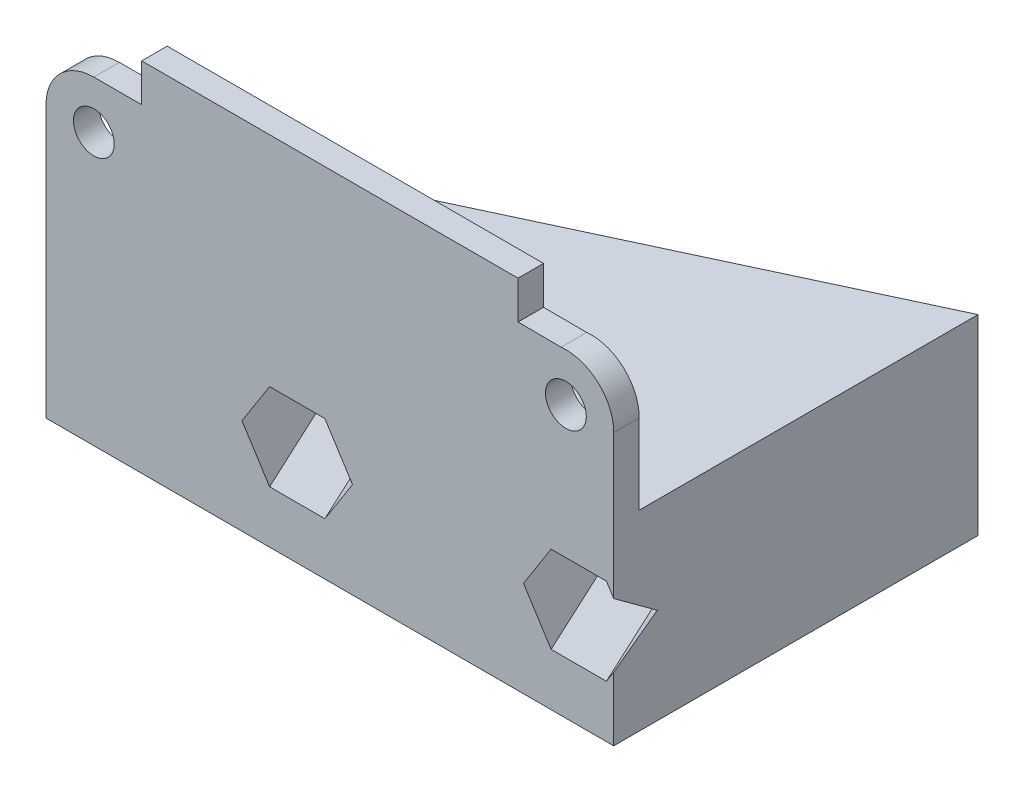
ISO-10303-21;
HEADER;
FILE_DESCRIPTION(('STEP AP214'),'2;1');
FILE_NAME('part.step','',(''),(''),'','','');
FILE_SCHEMA(('AUTOMOTIVE_DESIGN { 1 0 10303 214 1 1 1 1 }'));
ENDSEC;
DATA;
#1=APPLICATION_CONTEXT('core data for automotive mechanical design processes');
#2=APPLICATION_PROTOCOL_DEFINITION('international standard','automotive_design',2000,#1);
#3=PRODUCT_CONTEXT('',#1,'mechanical');
#4=PRODUCT('Part','Part','',(#3));
#5=PRODUCT_RELATED_PRODUCT_CATEGORY('part','',(#4));
#6=PRODUCT_DEFINITION_FORMATION('','',#4);
#7=PRODUCT_DEFINITION_CONTEXT('part definition',#1,'design');
#8=PRODUCT_DEFINITION('design','',#6,#7);
#9=PRODUCT_DEFINITION_SHAPE('','',#8);
#10=(LENGTH_UNIT() NAMED_UNIT(*) SI_UNIT(.MILLI.,.METRE.));
#11=(NAMED_UNIT(*) PLANE_ANGLE_UNIT() SI_UNIT($,.RADIAN.));
#12=(NAMED_UNIT(*) SI_UNIT($,.STERADIAN.) SOLID_ANGLE_UNIT());
#13=UNCERTAINTY_MEASURE_WITH_UNIT(LENGTH_MEASURE(1.E-05),#10,'distance_accuracy_value','');
#14=(GEOMETRIC_REPRESENTATION_CONTEXT(3) GLOBAL_UNCERTAINTY_ASSIGNED_CONTEXT((#13)) GLOBAL_UNIT_ASSIGNED_CONTEXT((#10,
#11,#12)) REPRESENTATION_CONTEXT('',''));
#15=CARTESIAN_POINT('',(0.,0.,0.));
#16=DIRECTION('',(0.,0.,1.));
#17=DIRECTION('',(1.,0.,0.));
#18=AXIS2_PLACEMENT_3D('',#15,#16,#17);
#19=CARTESIAN_POINT('',(7.49999999999989,0.,2.));
#20=DIRECTION('',(1.,0.,0.));
#21=DIRECTION('',(0.,1.,0.));
#22=AXIS2_PLACEMENT_3D('',#19,#20,#21);
#23=PLANE('',#22);
#24=DIRECTION('',(0.,0.590661858214401,-0.806919183841053));
#25=VECTOR('',#24,1.);
#26=CARTESIAN_POINT('',(7.49999999999989,-6.5106045135226,-2.76573842469685));
#27=LINE('',#26,#25);
#28=CARTESIAN_POINT('',(7.49999999999993,-9.99910741451406,2.));
#29=VERTEX_POINT('',#28);
#30=CARTESIAN_POINT('',(7.49999999999989,-7.50000000000001,-1.41409841723495));
#31=VERTEX_POINT('',#30);
#32=EDGE_CURVE('E281',#29,#31,#27,.T.);
#33=ORIENTED_EDGE('',*,*,#32,.F.);
#34=DIRECTION('',(0.,-1.,0.));
#35=VECTOR('',#34,1.);
#36=CARTESIAN_POINT('',(7.49999999999989,0.,2.));
#37=LINE('',#36,#35);
#38=CARTESIAN_POINT('',(7.49999999999989,-15.,2.));
#39=VERTEX_POINT('',#38);
#40=EDGE_CURVE('E319',#29,#39,#37,.T.);
#41=ORIENTED_EDGE('',*,*,#40,.T.);
#42=DIRECTION('',(0.,0.,-1.));
#43=VECTOR('',#42,1.);
#44=CARTESIAN_POINT('',(7.49999999999989,-15.,2.));
#45=LINE('',#44,#43);
#46=CARTESIAN_POINT('',(7.49999999999989,-15.,-26.5526670293718));
#47=VERTEX_POINT('',#46);
#48=EDGE_CURVE('E310',#39,#47,#45,.T.);
#49=ORIENTED_EDGE('',*,*,#48,.T.);
#50=DIRECTION('',(0.,-1.,0.));
#51=VECTOR('',#50,1.);
#52=CARTESIAN_POINT('',(7.49999999999989,0.,-26.5526670293718));
#53=LINE('',#52,#51);
#54=CARTESIAN_POINT('',(7.4999999999999,-6.3770507883697E-13,-26.5526670293718));
#55=VERTEX_POINT('',#54);
#56=EDGE_CURVE('E296',#55,#47,#53,.T.);
#57=ORIENTED_EDGE('',*,*,#56,.F.);
#58=DIRECTION('',(0.,0.,1.));
#59=VECTOR('',#58,1.);
#60=CARTESIAN_POINT('',(7.49999999999989,0.,-65.5647292333401));
#61=LINE('',#60,#59);
#62=CARTESIAN_POINT('',(7.49999999999989,0.,0.));
#63=VERTEX_POINT('',#62);
#64=EDGE_CURVE('E302',#55,#63,#61,.T.);
#65=ORIENTED_EDGE('',*,*,#64,.T.);
#66=DIRECTION('',(0.,-1.,0.));
#67=VECTOR('',#66,1.);
#68=CARTESIAN_POINT('',(7.49999999999989,0.,0.));
#69=LINE('',#68,#67);
#70=CARTESIAN_POINT('',(7.49999999999989,6.27312353150442,0.));
#71=VERTEX_POINT('',#70);
#72=EDGE_CURVE('E314',#71,#63,#69,.T.);
#73=ORIENTED_EDGE('',*,*,#72,.F.);
#74=DIRECTION('',(0.,0.,-1.));
#75=VECTOR('',#74,1.);
#76=CARTESIAN_POINT('',(7.49999999999989,6.27312353150442,2.));
#77=LINE('',#76,#75);
#78=CARTESIAN_POINT('',(7.49999999999989,6.27312353150442,2.));
#79=VERTEX_POINT('',#78);
#80=EDGE_CURVE('E388',#79,#71,#77,.T.);
#81=ORIENTED_EDGE('',*,*,#80,.F.);
#82=CARTESIAN_POINT('',(7.49999999999989,-5.00089258548602,2.));
#83=VERTEX_POINT('',#82);
#84=EDGE_CURVE('E315',#79,#83,#37,.T.);
#85=ORIENTED_EDGE('',*,*,#84,.T.);
#86=DIRECTION('',(0.,0.590661858214399,0.806919183841055));
#87=VECTOR('',#86,1.);
#88=CARTESIAN_POINT('',(7.49999999999989,-3.2561740252381,4.38350734364923));
#89=LINE('',#88,#87);
#90=EDGE_CURVE('E59',#31,#83,#89,.T.);
#91=ORIENTED_EDGE('',*,*,#90,.F.);
#92=EDGE_LOOP('',(#33,#41,#49,#57,#65,#73,#81,#85,#91));
#93=FACE_BOUND('',#92,.T.);
#94=ADVANCED_FACE('F37',(#93),#23,.T.);
#95=CARTESIAN_POINT('',(3.74999999999989,6.27312353150442,2.));
#96=DIRECTION('',(0.,0.,-1.));
#97=DIRECTION('',(-1.,0.,0.));
#98=AXIS2_PLACEMENT_3D('',#95,#96,#97);
#99=CYLINDRICAL_SURFACE('',#98,3.75);
#100=CARTESIAN_POINT('',(3.74999999999989,6.27312353150442,0.));
#101=DIRECTION('',(0.,0.,1.));
#102=DIRECTION('',(1.,0.,0.));
#103=AXIS2_PLACEMENT_3D('',#100,#101,#102);
#104=CIRCLE('',#103,3.75);
#105=CARTESIAN_POINT('',(3.37999999999985,10.0048255560503,0.));
#106=VERTEX_POINT('',#105);
#107=EDGE_CURVE('E345',#71,#106,#104,.T.);
#108=ORIENTED_EDGE('',*,*,#107,.T.);
#109=DIRECTION('',(0.,0.,-1.));
#110=VECTOR('',#109,1.);
#111=CARTESIAN_POINT('',(3.37999999999985,10.0048255560503,2.));
#112=LINE('',#111,#110);
#113=CARTESIAN_POINT('',(3.37999999999985,10.0048255560503,2.));
#114=VERTEX_POINT('',#113);
#115=EDGE_CURVE('E385',#114,#106,#112,.T.);
#116=ORIENTED_EDGE('',*,*,#115,.F.);
#117=CARTESIAN_POINT('',(3.74999999999989,6.27312353150442,2.));
#118=DIRECTION('',(0.,0.,1.));
#119=DIRECTION('',(1.,0.,0.));
#120=AXIS2_PLACEMENT_3D('',#117,#118,#119);
#121=CIRCLE('',#120,3.75);
#122=EDGE_CURVE('E318',#79,#114,#121,.T.);
#123=ORIENTED_EDGE('',*,*,#122,.F.);
#124=ORIENTED_EDGE('',*,*,#80,.T.);
#125=EDGE_LOOP('',(#108,#116,#123,#124));
#126=FACE_BOUND('',#125,.T.);
#127=ADVANCED_FACE('F436',(#126),#99,.T.);
#128=CARTESIAN_POINT('',(0.0542596134633969,10.0228297915413,2.));
#129=DIRECTION('',(-0.00541352287863934,-0.999985346777663,0.));
#130=DIRECTION('',(0.999985346777663,-0.00541352287863934,0.));
#131=AXIS2_PLACEMENT_3D('',#128,#129,#130);
#132=PLANE('',#131);
#133=DIRECTION('',(-0.999985346777663,0.00541352287863934,0.));
#134=VECTOR('',#133,1.);
#135=CARTESIAN_POINT('',(0.0542596134633969,10.0228297915413,0.));
#136=LINE('',#135,#134);
#137=CARTESIAN_POINT('',(-1.06502534655967E-13,10.0231235315044,0.));
#138=VERTEX_POINT('',#137);
#139=EDGE_CURVE('E347',#106,#138,#136,.T.);
#140=ORIENTED_EDGE('',*,*,#139,.T.);
#141=DIRECTION('',(0.,0.,-1.));
#142=VECTOR('',#141,1.);
#143=CARTESIAN_POINT('',(-1.06502534655967E-13,10.0231235315044,2.));
#144=LINE('',#143,#142);
#145=CARTESIAN_POINT('',(-1.06502534655967E-13,10.0231235315044,2.));
#146=VERTEX_POINT('',#145);
#147=EDGE_CURVE('E382',#146,#138,#144,.T.);
#148=ORIENTED_EDGE('',*,*,#147,.F.);
#149=DIRECTION('',(-0.999985346777663,0.00541352287863934,0.));
#150=VECTOR('',#149,1.);
#151=CARTESIAN_POINT('',(0.0542596134633969,10.0228297915413,2.));
#152=LINE('',#151,#150);
#153=EDGE_CURVE('E321',#114,#146,#152,.T.);
#154=ORIENTED_EDGE('',*,*,#153,.F.);
#155=ORIENTED_EDGE('',*,*,#115,.T.);
#156=EDGE_LOOP('',(#140,#148,#154,#155));
#157=FACE_BOUND('',#156,.T.);
#158=ADVANCED_FACE('F441',(#157),#132,.F.);
#159=CARTESIAN_POINT('',(0.,0.,2.));
#160=DIRECTION('',(-1.,0.,0.));
#161=DIRECTION('',(0.,-1.,0.));
#162=AXIS2_PLACEMENT_3D('',#159,#160,#161);
#163=PLANE('',#162);
#164=DIRECTION('',(0.,1.,0.));
#165=VECTOR('',#164,1.);
#166=CARTESIAN_POINT('',(0.,0.,0.));
#167=LINE('',#166,#165);
#168=CARTESIAN_POINT('',(0.,13.0000000000001,0.));
#169=VERTEX_POINT('',#168);
#170=EDGE_CURVE('E349',#138,#169,#167,.T.);
#171=ORIENTED_EDGE('',*,*,#170,.T.);
#172=DIRECTION('',(0.,0.,-1.));
#173=VECTOR('',#172,1.);
#174=CARTESIAN_POINT('',(0.,13.0000000000001,2.));
#175=LINE('',#174,#173);
#176=CARTESIAN_POINT('',(0.,13.0000000000001,2.));
#177=VERTEX_POINT('',#176);
#178=EDGE_CURVE('E379',#177,#169,#175,.T.);
#179=ORIENTED_EDGE('',*,*,#178,.F.);
#180=DIRECTION('',(0.,1.,0.));
#181=VECTOR('',#180,1.);
#182=CARTESIAN_POINT('',(0.,0.,2.));
#183=LINE('',#182,#181);
#184=EDGE_CURVE('E323',#146,#177,#183,.T.);
#185=ORIENTED_EDGE('',*,*,#184,.F.);
#186=ORIENTED_EDGE('',*,*,#147,.T.);
#187=EDGE_LOOP('',(#171,#179,#185,#186));
#188=FACE_BOUND('',#187,.T.);
#189=ADVANCED_FACE('F564',(#188),#163,.F.);
#190=CARTESIAN_POINT('',(0.,13.0000000000001,2.));
#191=DIRECTION('',(0.,-1.,0.));
#192=DIRECTION('',(1.,0.,0.));
#193=AXIS2_PLACEMENT_3D('',#190,#191,#192);
#194=PLANE('',#193);
#195=DIRECTION('',(-1.,0.,0.));
#196=VECTOR('',#195,1.);
#197=CARTESIAN_POINT('',(0.,13.0000000000001,0.));
#198=LINE('',#197,#196);
#199=CARTESIAN_POINT('',(-29.5000000000001,13.0000000000001,0.));
#200=VERTEX_POINT('',#199);
#201=EDGE_CURVE('E351',#169,#200,#198,.T.);
#202=ORIENTED_EDGE('',*,*,#201,.T.);
#203=DIRECTION('',(0.,0.,-1.));
#204=VECTOR('',#203,1.);
#205=CARTESIAN_POINT('',(-29.5000000000001,13.0000000000001,2.));
#206=LINE('',#205,#204);
#207=CARTESIAN_POINT('',(-29.5000000000001,13.0000000000001,2.));
#208=VERTEX_POINT('',#207);
#209=EDGE_CURVE('E376',#208,#200,#206,.T.);
#210=ORIENTED_EDGE('',*,*,#209,.F.);
#211=DIRECTION('',(-1.,0.,0.));
#212=VECTOR('',#211,1.);
#213=CARTESIAN_POINT('',(0.,13.0000000000001,2.));
#214=LINE('',#213,#212);
#215=EDGE_CURVE('E325',#177,#208,#214,.T.);
#216=ORIENTED_EDGE('',*,*,#215,.F.);
#217=ORIENTED_EDGE('',*,*,#178,.T.);
#218=EDGE_LOOP('',(#202,#210,#216,#217));
#219=FACE_BOUND('',#218,.T.);
#220=ADVANCED_FACE('F560',(#219),#194,.F.);
#221=CARTESIAN_POINT('',(-29.5000000000001,0.,2.));
#222=DIRECTION('',(1.,0.,0.));
#223=DIRECTION('',(0.,1.,0.));
#224=AXIS2_PLACEMENT_3D('',#221,#222,#223);
#225=PLANE('',#224);
#226=DIRECTION('',(0.,-1.,0.));
#227=VECTOR('',#226,1.);
#228=CARTESIAN_POINT('',(-29.5000000000001,0.,0.));
#229=LINE('',#228,#227);
#230=CARTESIAN_POINT('',(-29.5000000000001,10.0231235315044,0.));
#231=VERTEX_POINT('',#230);
#232=EDGE_CURVE('E353',#200,#231,#229,.T.);
#233=ORIENTED_EDGE('',*,*,#232,.T.);
#234=DIRECTION('',(0.,0.,-1.));
#235=VECTOR('',#234,1.);
#236=CARTESIAN_POINT('',(-29.5000000000001,10.0231235315044,2.));
#237=LINE('',#236,#235);
#238=CARTESIAN_POINT('',(-29.5000000000001,10.0231235315044,2.));
#239=VERTEX_POINT('',#238);
#240=EDGE_CURVE('E373',#239,#231,#237,.T.);
#241=ORIENTED_EDGE('',*,*,#240,.F.);
#242=DIRECTION('',(0.,-1.,0.));
#243=VECTOR('',#242,1.);
#244=CARTESIAN_POINT('',(-29.5000000000001,0.,2.));
#245=LINE('',#244,#243);
#246=EDGE_CURVE('E327',#208,#239,#245,.T.);
#247=ORIENTED_EDGE('',*,*,#246,.F.);
#248=ORIENTED_EDGE('',*,*,#209,.T.);
#249=EDGE_LOOP('',(#233,#241,#247,#248));
#250=FACE_BOUND('',#249,.T.);
#251=ADVANCED_FACE('F556',(#250),#225,.F.);
#252=CARTESIAN_POINT('',(0.,10.0231235315044,2.));
#253=DIRECTION('',(0.,-1.,0.));
#254=DIRECTION('',(0.,0.,-1.));
#255=AXIS2_PLACEMENT_3D('',#252,#253,#254);
#256=PLANE('',#255);
#257=DIRECTION('',(-1.,0.,0.));
#258=VECTOR('',#257,1.);
#259=CARTESIAN_POINT('',(0.,10.0231235315044,0.));
#260=LINE('',#259,#258);
#261=CARTESIAN_POINT('',(-33.2500000000001,10.0231235315044,0.));
#262=VERTEX_POINT('',#261);
#263=EDGE_CURVE('E355',#231,#262,#260,.T.);
#264=ORIENTED_EDGE('',*,*,#263,.T.);
#265=DIRECTION('',(0.,0.,-1.));
#266=VECTOR('',#265,1.);
#267=CARTESIAN_POINT('',(-33.2500000000001,10.0231235315044,2.));
#268=LINE('',#267,#266);
#269=CARTESIAN_POINT('',(-33.2500000000001,10.0231235315044,2.));
#270=VERTEX_POINT('',#269);
#271=EDGE_CURVE('E370',#270,#262,#268,.T.);
#272=ORIENTED_EDGE('',*,*,#271,.F.);
#273=DIRECTION('',(-1.,0.,0.));
#274=VECTOR('',#273,1.);
#275=CARTESIAN_POINT('',(0.,10.0231235315044,2.));
#276=LINE('',#275,#274);
#277=EDGE_CURVE('E329',#239,#270,#276,.T.);
#278=ORIENTED_EDGE('',*,*,#277,.F.);
#279=ORIENTED_EDGE('',*,*,#240,.T.);
#280=EDGE_LOOP('',(#264,#272,#278,#279));
#281=FACE_BOUND('',#280,.T.);
#282=ADVANCED_FACE('F552',(#281),#256,.F.);
#283=CARTESIAN_POINT('',(-33.2500000000001,6.27312353150443,2.));
#284=DIRECTION('',(0.,0.,-1.));
#285=DIRECTION('',(-1.,0.,0.));
#286=AXIS2_PLACEMENT_3D('',#283,#284,#285);
#287=CYLINDRICAL_SURFACE('',#286,3.75);
#288=CARTESIAN_POINT('',(-33.2500000000001,6.27312353150443,0.));
#289=DIRECTION('',(0.,0.,1.));
#290=DIRECTION('',(1.,0.,0.));
#291=AXIS2_PLACEMENT_3D('',#288,#289,#290);
#292=CIRCLE('',#291,3.75);
#293=CARTESIAN_POINT('',(-37.0000000000001,6.27312353150443,0.));
#294=VERTEX_POINT('',#293);
#295=EDGE_CURVE('E357',#262,#294,#292,.T.);
#296=ORIENTED_EDGE('',*,*,#295,.T.);
#297=DIRECTION('',(0.,0.,-1.));
#298=VECTOR('',#297,1.);
#299=CARTESIAN_POINT('',(-37.0000000000001,6.27312353150443,2.));
#300=LINE('',#299,#298);
#301=CARTESIAN_POINT('',(-37.0000000000001,6.27312353150443,2.));
#302=VERTEX_POINT('',#301);
#303=EDGE_CURVE('E342',#302,#294,#300,.T.);
#304=ORIENTED_EDGE('',*,*,#303,.F.);
#305=CARTESIAN_POINT('',(-33.2500000000001,6.27312353150443,2.));
#306=DIRECTION('',(0.,0.,1.));
#307=DIRECTION('',(1.,0.,0.));
#308=AXIS2_PLACEMENT_3D('',#305,#306,#307);
#309=CIRCLE('',#308,3.75);
#310=EDGE_CURVE('E331',#270,#302,#309,.T.);
#311=ORIENTED_EDGE('',*,*,#310,.F.);
#312=ORIENTED_EDGE('',*,*,#271,.T.);
#313=EDGE_LOOP('',(#296,#304,#311,#312));
#314=FACE_BOUND('',#313,.T.);
#315=ADVANCED_FACE('F548',(#314),#287,.T.);
#316=CARTESIAN_POINT('',(-37.0000000000001,0.,2.));
#317=DIRECTION('',(-1.,0.,0.));
#318=DIRECTION('',(0.,-1.,0.));
#319=AXIS2_PLACEMENT_3D('',#316,#317,#318);
#320=PLANE('',#319);
#321=DIRECTION('',(0.,1.,0.));
#322=VECTOR('',#321,1.);
#323=CARTESIAN_POINT('',(-37.0000000000001,0.,0.));
#324=LINE('',#323,#322);
#325=CARTESIAN_POINT('',(-37.0000000000001,0.,0.));
#326=VERTEX_POINT('',#325);
#327=EDGE_CURVE('E360',#326,#294,#324,.T.);
#328=ORIENTED_EDGE('',*,*,#327,.F.);
#329=DIRECTION('',(0.,0.,1.));
#330=VECTOR('',#329,1.);
#331=CARTESIAN_POINT('',(-37.0000000000001,0.,-65.5647292333401));
#332=LINE('',#331,#330);
#333=CARTESIAN_POINT('',(-37.0000000000001,0.,-5.80197624147447));
#334=VERTEX_POINT('',#333);
#335=EDGE_CURVE('E303',#334,#326,#332,.T.);
#336=ORIENTED_EDGE('',*,*,#335,.F.);
#337=DIRECTION('',(0.,1.,0.));
#338=VECTOR('',#337,1.);
#339=CARTESIAN_POINT('',(-37.0000000000001,0.,-5.80197624147447));
#340=LINE('',#339,#338);
#341=CARTESIAN_POINT('',(-37.0000000000001,-15.,-5.80197624147449));
#342=VERTEX_POINT('',#341);
#343=EDGE_CURVE('E290',#342,#334,#340,.T.);
#344=ORIENTED_EDGE('',*,*,#343,.F.);
#345=DIRECTION('',(0.,0.,-1.));
#346=VECTOR('',#345,1.);
#347=CARTESIAN_POINT('',(-37.0000000000001,-15.,2.));
#348=LINE('',#347,#346);
#349=CARTESIAN_POINT('',(-37.0000000000001,-15.,2.));
#350=VERTEX_POINT('',#349);
#351=EDGE_CURVE('E312',#350,#342,#348,.T.);
#352=ORIENTED_EDGE('',*,*,#351,.F.);
#353=DIRECTION('',(0.,1.,0.));
#354=VECTOR('',#353,1.);
#355=CARTESIAN_POINT('',(-37.0000000000001,0.,2.));
#356=LINE('',#355,#354);
#357=EDGE_CURVE('E333',#350,#302,#356,.T.);
#358=ORIENTED_EDGE('',*,*,#357,.T.);
#359=ORIENTED_EDGE('',*,*,#303,.T.);
#360=EDGE_LOOP('',(#328,#336,#344,#352,#358,#359));
#361=FACE_BOUND('',#360,.T.);
#362=ADVANCED_FACE('F544',(#361),#320,.T.);
#363=CARTESIAN_POINT('',(-33.2500000000001,6.27312353150443,2.));
#364=DIRECTION('',(0.,0.,-1.));
#365=DIRECTION('',(-1.,0.,0.));
#366=AXIS2_PLACEMENT_3D('',#363,#364,#365);
#367=CYLINDRICAL_SURFACE('',#366,1.6);
#368=CARTESIAN_POINT('',(-33.2500000000001,6.27312353150443,2.));
#369=DIRECTION('',(0.,0.,1.));
#370=DIRECTION('',(1.,0.,0.));
#371=AXIS2_PLACEMENT_3D('',#368,#369,#370);
#372=CIRCLE('',#371,1.6);
#373=CARTESIAN_POINT('',(-31.6500000000001,6.27312353150443,2.));
#374=VERTEX_POINT('',#373);
#375=EDGE_CURVE('E336',#374,#374,#372,.T.);
#376=ORIENTED_EDGE('',*,*,#375,.T.);
#377=EDGE_LOOP('',(#376));
#378=FACE_BOUND('',#377,.T.);
#379=CARTESIAN_POINT('',(-33.2500000000001,6.27312353150443,0.));
#380=DIRECTION('',(0.,0.,1.));
#381=DIRECTION('',(1.,0.,0.));
#382=AXIS2_PLACEMENT_3D('',#379,#380,#381);
#383=CIRCLE('',#382,1.6);
#384=CARTESIAN_POINT('',(-31.6500000000001,6.27312353150443,0.));
#385=VERTEX_POINT('',#384);
#386=EDGE_CURVE('E362',#385,#385,#383,.T.);
#387=ORIENTED_EDGE('',*,*,#386,.F.);
#388=EDGE_LOOP('',(#387));
#389=FACE_BOUND('',#388,.T.);
#390=ADVANCED_FACE('F540',(#378,#389),#367,.F.);
#391=CARTESIAN_POINT('',(3.74999999999989,6.27312353150442,2.));
#392=DIRECTION('',(0.,0.,-1.));
#393=DIRECTION('',(-1.,0.,0.));
#394=AXIS2_PLACEMENT_3D('',#391,#392,#393);
#395=CYLINDRICAL_SURFACE('',#394,1.6);
#396=CARTESIAN_POINT('',(3.74999999999989,6.27312353150442,2.));
#397=DIRECTION('',(0.,0.,1.));
#398=DIRECTION('',(1.,0.,0.));
#399=AXIS2_PLACEMENT_3D('',#396,#397,#398);
#400=CIRCLE('',#399,1.6);
#401=CARTESIAN_POINT('',(5.34999999999989,6.27312353150442,2.));
#402=VERTEX_POINT('',#401);
#403=EDGE_CURVE('E339',#402,#402,#400,.T.);
#404=ORIENTED_EDGE('',*,*,#403,.T.);
#405=EDGE_LOOP('',(#404));
#406=FACE_BOUND('',#405,.T.);
#407=CARTESIAN_POINT('',(3.74999999999989,6.27312353150442,0.));
#408=DIRECTION('',(0.,0.,1.));
#409=DIRECTION('',(1.,0.,0.));
#410=AXIS2_PLACEMENT_3D('',#407,#408,#409);
#411=CIRCLE('',#410,1.6);
#412=CARTESIAN_POINT('',(5.34999999999989,6.27312353150442,0.));
#413=VERTEX_POINT('',#412);
#414=EDGE_CURVE('E365',#413,#413,#411,.T.);
#415=ORIENTED_EDGE('',*,*,#414,.F.);
#416=EDGE_LOOP('',(#415));
#417=FACE_BOUND('',#416,.T.);
#418=ADVANCED_FACE('F535',(#406,#417),#395,.F.);
#419=CARTESIAN_POINT('',(0.,0.,2.));
#420=DIRECTION('',(0.,0.,1.));
#421=DIRECTION('',(1.,0.,0.));
#422=AXIS2_PLACEMENT_3D('',#419,#420,#421);
#423=PLANE('',#422);
#424=DIRECTION('',(-0.537278777543522,0.843404716136529,0.));
#425=VECTOR('',#424,1.);
#426=CARTESIAN_POINT('',(-12.628485118268,-8.04479381814514,2.));
#427=LINE('',#426,#425);
#428=CARTESIAN_POINT('',(-12.9755381415984,-7.50000000000002,2.));
#429=VERTEX_POINT('',#428);
#430=CARTESIAN_POINT('',(-15.1414589726034,-4.10000000000001,2.));
#431=VERTEX_POINT('',#430);
#432=EDGE_CURVE('E11',#429,#431,#427,.T.);
#433=ORIENTED_EDGE('',*,*,#432,.F.);
#434=DIRECTION('',(0.53727877754352,0.84340471613653,0.));
#435=VECTOR('',#434,1.);
#436=CARTESIAN_POINT('',(-5.83133329536394,3.71476654616522,2.));
#437=LINE('',#436,#435);
#438=CARTESIAN_POINT('',(-15.1414589726034,-10.9,2.));
#439=VERTEX_POINT('',#438);
#440=EDGE_CURVE('E206',#439,#429,#437,.T.);
#441=ORIENTED_EDGE('',*,*,#440,.F.);
#442=DIRECTION('',(1.,0.,0.));
#443=VECTOR('',#442,1.);
#444=CARTESIAN_POINT('',(0.,-10.9,2.));
#445=LINE('',#444,#443);
#446=CARTESIAN_POINT('',(-19.4733006346134,-10.9,2.));
#447=VERTEX_POINT('',#446);
#448=EDGE_CURVE('E403',#447,#439,#445,.T.);
#449=ORIENTED_EDGE('',*,*,#448,.F.);
#450=DIRECTION('',(0.53727877754352,-0.84340471613653,0.));
#451=VECTOR('',#450,1.);
#452=CARTESIAN_POINT('',(-18.7912361043678,-11.9706852114069,2.));
#453=LINE('',#452,#451);
#454=CARTESIAN_POINT('',(-21.6392214656184,-7.50000000000002,2.));
#455=VERTEX_POINT('',#454);
#456=EDGE_CURVE('E405',#455,#447,#453,.T.);
#457=ORIENTED_EDGE('',*,*,#456,.F.);
#458=DIRECTION('',(-0.537278777543519,-0.84340471613653,0.));
#459=VECTOR('',#458,1.);
#460=CARTESIAN_POINT('',(-11.9940842814637,7.64065793942699,2.));
#461=LINE('',#460,#459);
#462=CARTESIAN_POINT('',(-19.4733006346134,-4.10000000000001,2.));
#463=VERTEX_POINT('',#462);
#464=EDGE_CURVE('E407',#463,#455,#461,.T.);
#465=ORIENTED_EDGE('',*,*,#464,.F.);
#466=DIRECTION('',(-1.,0.,0.));
#467=VECTOR('',#466,1.);
#468=CARTESIAN_POINT('',(0.,-4.10000000000001,2.));
#469=LINE('',#468,#467);
#470=EDGE_CURVE('E44',#431,#463,#469,.T.);
#471=ORIENTED_EDGE('',*,*,#470,.F.);
#472=EDGE_LOOP('',(#433,#441,#449,#457,#465,#471));
#473=FACE_BOUND('',#472,.T.);
#474=DIRECTION('',(0.53727877754352,0.84340471613653,0.));
#475=VECTOR('',#474,1.);
#476=CARTESIAN_POINT('',(9.86601644334189,-6.28500309813884,2.));
#477=LINE('',#476,#475);
#478=CARTESIAN_POINT('',(6.9260994066464,-10.9,2.));
#479=VERTEX_POINT('',#478);
#480=EDGE_CURVE('E400',#479,#29,#477,.T.);
#481=ORIENTED_EDGE('',*,*,#480,.F.);
#482=DIRECTION('',(1.,0.,0.));
#483=VECTOR('',#482,1.);
#484=CARTESIAN_POINT('',(0.,-10.9,2.));
#485=LINE('',#484,#483);
#486=CARTESIAN_POINT('',(2.59425774463639,-10.9,2.));
#487=VERTEX_POINT('',#486);
#488=EDGE_CURVE('E398',#487,#479,#485,.T.);
#489=ORIENTED_EDGE('',*,*,#488,.F.);
#490=DIRECTION('',(0.537278777543521,-0.84340471613653,0.));
#491=VECTOR('',#490,1.);
#492=CARTESIAN_POINT('',(-3.09388636566199,-1.97091556710284,2.));
#493=LINE('',#492,#491);
#494=CARTESIAN_POINT('',(0.428336913631382,-7.50000000000002,2.));
#495=VERTEX_POINT('',#494);
#496=EDGE_CURVE('E396',#495,#487,#493,.T.);
#497=ORIENTED_EDGE('',*,*,#496,.F.);
#498=DIRECTION('',(-0.537278777543521,-0.843404716136529,0.));
#499=VECTOR('',#498,1.);
#500=CARTESIAN_POINT('',(3.70326545724214,-2.35911170487707,2.));
#501=LINE('',#500,#499);
#502=CARTESIAN_POINT('',(2.59425774463639,-4.10000000000001,2.));
#503=VERTEX_POINT('',#502);
#504=EDGE_CURVE('E394',#503,#495,#501,.T.);
#505=ORIENTED_EDGE('',*,*,#504,.F.);
#506=DIRECTION('',(-1.,0.,0.));
#507=VECTOR('',#506,1.);
#508=CARTESIAN_POINT('',(0.,-4.10000000000002,2.));
#509=LINE('',#508,#507);
#510=CARTESIAN_POINT('',(6.92609940664639,-4.10000000000001,2.));
#511=VERTEX_POINT('',#510);
#512=EDGE_CURVE('E392',#511,#503,#509,.T.);
#513=ORIENTED_EDGE('',*,*,#512,.F.);
#514=DIRECTION('',(-0.537278777543521,0.843404716136529,0.));
#515=VECTOR('',#514,1.);
#516=CARTESIAN_POINT('',(3.06886462043774,1.95497582615893,2.));
#517=LINE('',#516,#515);
#518=EDGE_CURVE('E390',#83,#511,#517,.T.);
#519=ORIENTED_EDGE('',*,*,#518,.F.);
#520=ORIENTED_EDGE('',*,*,#84,.F.);
#521=ORIENTED_EDGE('',*,*,#122,.T.);
#522=ORIENTED_EDGE('',*,*,#153,.T.);
#523=ORIENTED_EDGE('',*,*,#184,.T.);
#524=ORIENTED_EDGE('',*,*,#215,.T.);
#525=ORIENTED_EDGE('',*,*,#246,.T.);
#526=ORIENTED_EDGE('',*,*,#277,.T.);
#527=ORIENTED_EDGE('',*,*,#310,.T.);
#528=ORIENTED_EDGE('',*,*,#357,.F.);
#529=DIRECTION('',(-1.,0.,0.));
#530=VECTOR('',#529,1.);
#531=CARTESIAN_POINT('',(0.,-15.,2.));
#532=LINE('',#531,#530);
#533=EDGE_CURVE('E299',#39,#350,#532,.T.);
#534=ORIENTED_EDGE('',*,*,#533,.F.);
#535=ORIENTED_EDGE('',*,*,#40,.F.);
#536=EDGE_LOOP('',(#481,#489,#497,#505,#513,#519,#520,#521,#522,#523,#524,#525,#526,#527,#528,
#534,#535));
#537=FACE_BOUND('',#536,.T.);
#538=ORIENTED_EDGE('',*,*,#375,.F.);
#539=EDGE_LOOP('',(#538));
#540=FACE_BOUND('',#539,.T.);
#541=ORIENTED_EDGE('',*,*,#403,.F.);
#542=EDGE_LOOP('',(#541));
#543=FACE_BOUND('',#542,.T.);
#544=ADVANCED_FACE('F419',(#473,#537,#540,#543),#423,.T.);
#545=CARTESIAN_POINT('',(0.,0.,0.));
#546=DIRECTION('',(0.,0.,1.));
#547=DIRECTION('',(1.,0.,0.));
#548=AXIS2_PLACEMENT_3D('',#545,#546,#547);
#549=PLANE('',#548);
#550=ORIENTED_EDGE('',*,*,#72,.T.);
#551=DIRECTION('',(-1.,0.,0.));
#552=VECTOR('',#551,1.);
#553=CARTESIAN_POINT('',(0.,0.,0.));
#554=LINE('',#553,#552);
#555=EDGE_CURVE('E287',#63,#326,#554,.T.);
#556=ORIENTED_EDGE('',*,*,#555,.T.);
#557=ORIENTED_EDGE('',*,*,#327,.T.);
#558=ORIENTED_EDGE('',*,*,#295,.F.);
#559=ORIENTED_EDGE('',*,*,#263,.F.);
#560=ORIENTED_EDGE('',*,*,#232,.F.);
#561=ORIENTED_EDGE('',*,*,#201,.F.);
#562=ORIENTED_EDGE('',*,*,#170,.F.);
#563=ORIENTED_EDGE('',*,*,#139,.F.);
#564=ORIENTED_EDGE('',*,*,#107,.F.);
#565=EDGE_LOOP('',(#550,#556,#557,#558,#559,#560,#561,#562,#563,#564));
#566=FACE_BOUND('',#565,.T.);
#567=ORIENTED_EDGE('',*,*,#386,.T.);
#568=EDGE_LOOP('',(#567));
#569=FACE_BOUND('',#568,.T.);
#570=ORIENTED_EDGE('',*,*,#414,.T.);
#571=EDGE_LOOP('',(#570));
#572=FACE_BOUND('',#571,.T.);
#573=ADVANCED_FACE('F468',(#566,#569,#572),#549,.F.);
#574=CARTESIAN_POINT('',(0.,-15.,2.));
#575=DIRECTION('',(0.,-1.,0.));
#576=DIRECTION('',(1.,0.,0.));
#577=AXIS2_PLACEMENT_3D('',#574,#575,#576);
#578=PLANE('',#577);
#579=ORIENTED_EDGE('',*,*,#351,.T.);
#580=DIRECTION('',(-0.906307787036651,0.,0.422618261740698));
#581=VECTOR('',#580,1.);
#582=CARTESIAN_POINT('',(16.2820331966563,-15.,-30.6477963631441));
#583=LINE('',#582,#581);
#584=EDGE_CURVE('E292',#47,#342,#583,.T.);
#585=ORIENTED_EDGE('',*,*,#584,.F.);
#586=ORIENTED_EDGE('',*,*,#48,.F.);
#587=ORIENTED_EDGE('',*,*,#533,.T.);
#588=EDGE_LOOP('',(#579,#585,#586,#587));
#589=FACE_BOUND('',#588,.T.);
#590=ADVANCED_FACE('F453',(#589),#578,.T.);
#591=CARTESIAN_POINT('',(0.,0.,-65.5647292333401));
#592=DIRECTION('',(0.,1.,0.));
#593=DIRECTION('',(-1.,0.,0.));
#594=AXIS2_PLACEMENT_3D('',#591,#592,#593);
#595=PLANE('',#594);
#596=ORIENTED_EDGE('',*,*,#64,.F.);
#597=DIRECTION('',(-0.906307787036651,0.,0.422618261740698));
#598=VECTOR('',#597,1.);
#599=CARTESIAN_POINT('',(16.2820331966563,0.,-30.6477963631441));
#600=LINE('',#599,#598);
#601=EDGE_CURVE('E293',#55,#334,#600,.T.);
#602=ORIENTED_EDGE('',*,*,#601,.T.);
#603=ORIENTED_EDGE('',*,*,#335,.T.);
#604=ORIENTED_EDGE('',*,*,#555,.F.);
#605=EDGE_LOOP('',(#596,#602,#603,#604));
#606=FACE_BOUND('',#605,.T.);
#607=ADVANCED_FACE('F462',(#606),#595,.T.);
#608=CARTESIAN_POINT('',(-41.3077273826378,-64.7999999999976,-3.79324997370661));
#609=DIRECTION('',(-0.422618261740698,0.,-0.906307787036651));
#610=DIRECTION('',(-0.906307787036651,0.,0.422618261740698));
#611=AXIS2_PLACEMENT_3D('',#608,#609,#610);
#612=PLANE('',#611);
#613=CARTESIAN_POINT('',(-23.8129340421164,-7.5,-11.9512060862307));
#614=DIRECTION('',(-0.422618261740698,0.,-0.906307787036651));
#615=DIRECTION('',(-0.906307787036651,0.,0.422618261740698));
#616=AXIS2_PLACEMENT_3D('',#613,#614,#615);
#617=CIRCLE('',#616,2.);
#618=CARTESIAN_POINT('',(-25.6255496161897,-7.5,-11.1059695627493));
#619=VERTEX_POINT('',#618);
#620=EDGE_CURVE('E284',#619,#619,#617,.T.);
#621=ORIENTED_EDGE('',*,*,#620,.F.);
#622=EDGE_LOOP('',(#621));
#623=FACE_BOUND('',#622,.T.);
#624=CARTESIAN_POINT('',(-5.68677830138339,-7.49999999999999,-20.4035713210447));
#625=DIRECTION('',(-0.422618261740698,0.,-0.906307787036651));
#626=DIRECTION('',(-0.906307787036651,0.,0.422618261740698));
#627=AXIS2_PLACEMENT_3D('',#624,#625,#626);
#628=CIRCLE('',#627,2.);
#629=CARTESIAN_POINT('',(-7.49939387545669,-7.49999999999999,-19.5583347975633));
#630=VERTEX_POINT('',#629);
#631=EDGE_CURVE('E283',#630,#630,#628,.T.);
#632=ORIENTED_EDGE('',*,*,#631,.F.);
#633=EDGE_LOOP('',(#632));
#634=FACE_BOUND('',#633,.T.);
#635=ORIENTED_EDGE('',*,*,#56,.T.);
#636=ORIENTED_EDGE('',*,*,#584,.T.);
#637=ORIENTED_EDGE('',*,*,#343,.T.);
#638=ORIENTED_EDGE('',*,*,#601,.F.);
#639=EDGE_LOOP('',(#635,#636,#637,#638));
#640=FACE_BOUND('',#639,.T.);
#641=ADVANCED_FACE('F458',(#623,#634,#640),#612,.T.);
#642=CARTESIAN_POINT('',(5.24952765565496,-7.50000000000002,3.04941248863409));
#643=DIRECTION('',(-0.422618261740698,0.,-0.906307787036651));
#644=DIRECTION('',(-0.906307787036651,0.,0.422618261740698));
#645=AXIS2_PLACEMENT_3D('',#642,#643,#644);
#646=CYLINDRICAL_SURFACE('',#645,2.);
#647=CARTESIAN_POINT('',(-3.99630525442059,-7.49999999999999,-16.7783401728981));
#648=DIRECTION('',(-0.422618261740698,0.,-0.906307787036651));
#649=DIRECTION('',(-0.906307787036651,0.,0.422618261740698));
#650=AXIS2_PLACEMENT_3D('',#647,#648,#649);
#651=CIRCLE('',#650,2.);
#652=CARTESIAN_POINT('',(-5.8089208284939,-7.49999999999999,-15.9331036494167));
#653=VERTEX_POINT('',#652);
#654=EDGE_CURVE('E248',#653,#653,#651,.T.);
#655=ORIENTED_EDGE('',*,*,#654,.F.);
#656=EDGE_LOOP('',(#655));
#657=FACE_BOUND('',#656,.T.);
#658=ORIENTED_EDGE('',*,*,#631,.T.);
#659=EDGE_LOOP('',(#658));
#660=FACE_BOUND('',#659,.T.);
#661=ADVANCED_FACE('F521',(#657,#660),#646,.F.);
#662=CARTESIAN_POINT('',(-12.8766280850781,-7.50000000000003,11.501777723448));
#663=DIRECTION('',(-0.422618261740698,0.,-0.906307787036651));
#664=DIRECTION('',(-0.906307787036651,0.,0.422618261740698));
#665=AXIS2_PLACEMENT_3D('',#662,#663,#664);
#666=CYLINDRICAL_SURFACE('',#665,2.);
#667=CARTESIAN_POINT('',(-22.1224609951536,-7.5,-8.32597493808411));
#668=DIRECTION('',(-0.422618261740698,0.,-0.906307787036651));
#669=DIRECTION('',(-0.906307787036651,0.,0.422618261740698));
#670=AXIS2_PLACEMENT_3D('',#667,#668,#669);
#671=CIRCLE('',#670,2.);
#672=CARTESIAN_POINT('',(-23.9350765692269,-7.5,-7.48073841460272));
#673=VERTEX_POINT('',#672);
#674=EDGE_CURVE('E226',#673,#673,#671,.T.);
#675=ORIENTED_EDGE('',*,*,#674,.F.);
#676=EDGE_LOOP('',(#675));
#677=FACE_BOUND('',#676,.T.);
#678=ORIENTED_EDGE('',*,*,#620,.T.);
#679=EDGE_LOOP('',(#678));
#680=FACE_BOUND('',#679,.T.);
#681=ADVANCED_FACE('F518',(#677,#680),#666,.F.);
#682=CARTESIAN_POINT('',(-11.0975541327096,-4.10000000000003,10.6721819150345));
#683=DIRECTION('',(0.784885567221396,0.500000000000001,-0.365998150770664));
#684=DIRECTION('',(-0.537278777543522,0.843404716136529,0.));
#685=AXIS2_PLACEMENT_3D('',#682,#683,#684);
#686=PLANE('',#685);
#687=ORIENTED_EDGE('',*,*,#432,.T.);
#688=DIRECTION('',(-0.422618261740698,0.,-0.906307787036651));
#689=VECTOR('',#688,1.);
#690=CARTESIAN_POINT('',(-11.0975541327096,-4.10000000000003,10.6721819150345));
#691=LINE('',#690,#689);
#692=CARTESIAN_POINT('',(-20.3433870427851,-4.1,-9.15557074649761));
#693=VERTEX_POINT('',#692);
#694=EDGE_CURVE('E225',#431,#693,#691,.T.);
#695=ORIENTED_EDGE('',*,*,#694,.T.);
#696=DIRECTION('',(0.453153893518326,-0.866025403784438,-0.211309130870351));
#697=VECTOR('',#696,1.);
#698=CARTESIAN_POINT('',(-20.3433870427851,-4.1,-9.15557074649761));
#699=LINE('',#698,#697);
#700=CARTESIAN_POINT('',(-18.5643130904166,-7.5,-9.98516655491113));
#701=VERTEX_POINT('',#700);
#702=EDGE_CURVE('E217',#693,#701,#699,.T.);
#703=ORIENTED_EDGE('',*,*,#702,.T.);
#704=DIRECTION('',(-0.422618261740698,0.,-0.906307787036651));
#705=VECTOR('',#704,1.);
#706=CARTESIAN_POINT('',(-9.31848018034106,-7.50000000000003,9.84258610662102));
#707=LINE('',#706,#705);
#708=EDGE_CURVE('E201',#429,#701,#707,.T.);
#709=ORIENTED_EDGE('',*,*,#708,.F.);
#710=EDGE_LOOP('',(#687,#695,#703,#709));
#711=FACE_BOUND('',#710,.T.);
#712=ADVANCED_FACE('F223',(#711),#686,.F.);
#713=CARTESIAN_POINT('',(-14.6557020374466,-4.10000000000003,12.3313735318616));
#714=DIRECTION('',(0.,1.,0.));
#715=DIRECTION('',(0.,0.,1.));
#716=AXIS2_PLACEMENT_3D('',#713,#714,#715);
#717=PLANE('',#716);
#718=ORIENTED_EDGE('',*,*,#470,.T.);
#719=DIRECTION('',(-0.422618261740698,0.,-0.906307787036651));
#720=VECTOR('',#719,1.);
#721=CARTESIAN_POINT('',(-14.6557020374466,-4.10000000000003,12.3313735318616));
#722=LINE('',#721,#720);
#723=CARTESIAN_POINT('',(-23.9015349475221,-4.1,-7.4963791296706));
#724=VERTEX_POINT('',#723);
#725=EDGE_CURVE('E241',#463,#724,#722,.T.);
#726=ORIENTED_EDGE('',*,*,#725,.T.);
#727=DIRECTION('',(0.906307787036651,0.,-0.422618261740698));
#728=VECTOR('',#727,1.);
#729=CARTESIAN_POINT('',(-23.9015349475221,-4.1,-7.4963791296706));
#730=LINE('',#729,#728);
#731=EDGE_CURVE('E210',#724,#693,#730,.T.);
#732=ORIENTED_EDGE('',*,*,#731,.T.);
#733=ORIENTED_EDGE('',*,*,#694,.F.);
#734=EDGE_LOOP('',(#718,#726,#732,#733));
#735=FACE_BOUND('',#734,.T.);
#736=ADVANCED_FACE('F411',(#735),#717,.F.);
#737=CARTESIAN_POINT('',(-16.4347759898151,-7.50000000000003,13.1609693402751));
#738=DIRECTION('',(-0.784885567221397,0.499999999999998,0.365998150770666));
#739=DIRECTION('',(-0.537278777543519,-0.84340471613653,0.));
#740=AXIS2_PLACEMENT_3D('',#737,#738,#739);
#741=PLANE('',#740);
#742=ORIENTED_EDGE('',*,*,#464,.T.);
#743=DIRECTION('',(-0.422618261740698,0.,-0.906307787036651));
#744=VECTOR('',#743,1.);
#745=CARTESIAN_POINT('',(-16.4347759898151,-7.50000000000003,13.1609693402751));
#746=LINE('',#745,#744);
#747=CARTESIAN_POINT('',(-25.6806088998906,-7.50000000000001,-6.6667833212571));
#748=VERTEX_POINT('',#747);
#749=EDGE_CURVE('E243',#455,#748,#746,.T.);
#750=ORIENTED_EDGE('',*,*,#749,.T.);
#751=DIRECTION('',(0.453153893518324,0.86602540378444,-0.211309130870347));
#752=VECTOR('',#751,1.);
#753=CARTESIAN_POINT('',(-25.6806088998906,-7.50000000000001,-6.6667833212571));
#754=LINE('',#753,#752);
#755=EDGE_CURVE('E236',#748,#724,#754,.T.);
#756=ORIENTED_EDGE('',*,*,#755,.T.);
#757=ORIENTED_EDGE('',*,*,#725,.F.);
#758=EDGE_LOOP('',(#742,#750,#756,#757));
#759=FACE_BOUND('',#758,.T.);
#760=ADVANCED_FACE('F415',(#759),#741,.F.);
#761=CARTESIAN_POINT('',(-14.6557020374466,-10.9,12.3313735318615));
#762=DIRECTION('',(-0.784885567221397,-0.5,0.365998150770665));
#763=DIRECTION('',(0.53727877754352,-0.84340471613653,0.));
#764=AXIS2_PLACEMENT_3D('',#761,#762,#763);
#765=PLANE('',#764);
#766=ORIENTED_EDGE('',*,*,#456,.T.);
#767=DIRECTION('',(-0.422618261740698,0.,-0.906307787036651));
#768=VECTOR('',#767,1.);
#769=CARTESIAN_POINT('',(-14.6557020374466,-10.9,12.3313735318615));
#770=LINE('',#769,#768);
#771=CARTESIAN_POINT('',(-23.9015349475221,-10.9,-7.49637912967061));
#772=VERTEX_POINT('',#771);
#773=EDGE_CURVE('E245',#447,#772,#770,.T.);
#774=ORIENTED_EDGE('',*,*,#773,.T.);
#775=DIRECTION('',(-0.453153893518325,0.866025403784439,0.211309130870349));
#776=VECTOR('',#775,1.);
#777=CARTESIAN_POINT('',(-23.9015349475221,-10.9,-7.49637912967061));
#778=LINE('',#777,#776);
#779=EDGE_CURVE('E233',#772,#748,#778,.T.);
#780=ORIENTED_EDGE('',*,*,#779,.T.);
#781=ORIENTED_EDGE('',*,*,#749,.F.);
#782=EDGE_LOOP('',(#766,#774,#780,#781));
#783=FACE_BOUND('',#782,.T.);
#784=ADVANCED_FACE('F424',(#783),#765,.F.);
#785=CARTESIAN_POINT('',(-11.0975541327096,-10.9,10.6721819150345));
#786=DIRECTION('',(0.,-1.,0.));
#787=DIRECTION('',(0.,0.,-1.));
#788=AXIS2_PLACEMENT_3D('',#785,#786,#787);
#789=PLANE('',#788);
#790=ORIENTED_EDGE('',*,*,#448,.T.);
#791=DIRECTION('',(-0.422618261740698,0.,-0.906307787036651));
#792=VECTOR('',#791,1.);
#793=CARTESIAN_POINT('',(-11.0975541327096,-10.9,10.6721819150345));
#794=LINE('',#793,#792);
#795=CARTESIAN_POINT('',(-20.3433870427851,-10.9,-9.15557074649763));
#796=VERTEX_POINT('',#795);
#797=EDGE_CURVE('E51',#439,#796,#794,.T.);
#798=ORIENTED_EDGE('',*,*,#797,.T.);
#799=DIRECTION('',(-0.906307787036651,0.,0.422618261740698));
#800=VECTOR('',#799,1.);
#801=CARTESIAN_POINT('',(-20.3433870427851,-10.9,-9.15557074649763));
#802=LINE('',#801,#800);
#803=EDGE_CURVE('E221',#796,#772,#802,.T.);
#804=ORIENTED_EDGE('',*,*,#803,.T.);
#805=ORIENTED_EDGE('',*,*,#773,.F.);
#806=EDGE_LOOP('',(#790,#798,#804,#805));
#807=FACE_BOUND('',#806,.T.);
#808=ADVANCED_FACE('F426',(#807),#789,.F.);
#809=CARTESIAN_POINT('',(-9.31848018034106,-7.50000000000003,9.84258610662102));
#810=DIRECTION('',(0.784885567221397,-0.499999999999999,-0.365998150770666));
#811=DIRECTION('',(0.53727877754352,0.84340471613653,0.));
#812=AXIS2_PLACEMENT_3D('',#809,#810,#811);
#813=PLANE('',#812);
#814=ORIENTED_EDGE('',*,*,#440,.T.);
#815=ORIENTED_EDGE('',*,*,#708,.T.);
#816=DIRECTION('',(-0.453153893518325,-0.866025403784439,0.211309130870348));
#817=VECTOR('',#816,1.);
#818=CARTESIAN_POINT('',(-18.5643130904166,-7.5,-9.98516655491113));
#819=LINE('',#818,#817);
#820=EDGE_CURVE('E204',#701,#796,#819,.T.);
#821=ORIENTED_EDGE('',*,*,#820,.T.);
#822=ORIENTED_EDGE('',*,*,#797,.F.);
#823=EDGE_LOOP('',(#814,#815,#821,#822));
#824=FACE_BOUND('',#823,.T.);
#825=ADVANCED_FACE('F203',(#824),#813,.F.);
#826=CARTESIAN_POINT('',(-7.14024200328114,0.,-15.3122983901495));
#827=DIRECTION('',(-0.422618261740698,0.,-0.906307787036651));
#828=DIRECTION('',(-0.906307787036651,0.,0.422618261740698));
#829=AXIS2_PLACEMENT_3D('',#826,#827,#828);
#830=PLANE('',#829);
#831=ORIENTED_EDGE('',*,*,#674,.T.);
#832=EDGE_LOOP('',(#831));
#833=FACE_BOUND('',#832,.T.);
#834=ORIENTED_EDGE('',*,*,#702,.F.);
#835=ORIENTED_EDGE('',*,*,#731,.F.);
#836=ORIENTED_EDGE('',*,*,#755,.F.);
#837=ORIENTED_EDGE('',*,*,#779,.F.);
#838=ORIENTED_EDGE('',*,*,#803,.F.);
#839=ORIENTED_EDGE('',*,*,#820,.F.);
#840=EDGE_LOOP('',(#834,#835,#836,#837,#838,#839));
#841=FACE_BOUND('',#840,.T.);
#842=ADVANCED_FACE('F215',(#833,#841),#830,.F.);
#843=CARTESIAN_POINT('',(3.47045370328646,-4.10000000000002,3.8790082970476));
#844=DIRECTION('',(0.,1.,0.));
#845=DIRECTION('',(0.,0.,1.));
#846=AXIS2_PLACEMENT_3D('',#843,#844,#845);
#847=PLANE('',#846);
#848=ORIENTED_EDGE('',*,*,#512,.T.);
#849=DIRECTION('',(-0.422618261740698,0.,-0.906307787036651));
#850=VECTOR('',#849,1.);
#851=CARTESIAN_POINT('',(3.47045370328646,-4.10000000000002,3.8790082970476));
#852=LINE('',#851,#850);
#853=CARTESIAN_POINT('',(-5.77537920678909,-4.09999999999999,-15.9487443644846));
#854=VERTEX_POINT('',#853);
#855=EDGE_CURVE('E229',#503,#854,#852,.T.);
#856=ORIENTED_EDGE('',*,*,#855,.T.);
#857=DIRECTION('',(0.906307787036651,0.,-0.422618261740697));
#858=VECTOR('',#857,1.);
#859=CARTESIAN_POINT('',(-5.77537920678909,-4.09999999999999,-15.9487443644846));
#860=LINE('',#859,#858);
#861=CARTESIAN_POINT('',(-2.2172313020521,-4.09999999999999,-17.6079359813116));
#862=VERTEX_POINT('',#861);
#863=EDGE_CURVE('E251',#854,#862,#860,.T.);
#864=ORIENTED_EDGE('',*,*,#863,.T.);
#865=DIRECTION('',(-0.422618261740698,0.,-0.906307787036651));
#866=VECTOR('',#865,1.);
#867=CARTESIAN_POINT('',(7.02860160802345,-4.10000000000002,2.21981668022059));
#868=LINE('',#867,#866);
#869=EDGE_CURVE('E269',#511,#862,#868,.T.);
#870=ORIENTED_EDGE('',*,*,#869,.F.);
#871=EDGE_LOOP('',(#848,#856,#864,#870));
#872=FACE_BOUND('',#871,.T.);
#873=ADVANCED_FACE('F486',(#872),#847,.F.);
#874=CARTESIAN_POINT('',(1.69137975091796,-7.50000000000002,4.7086041054611));
#875=DIRECTION('',(-0.784885567221396,0.5,0.365998150770666));
#876=DIRECTION('',(-0.537278777543521,-0.843404716136529,0.));
#877=AXIS2_PLACEMENT_3D('',#874,#875,#876);
#878=PLANE('',#877);
#879=ORIENTED_EDGE('',*,*,#504,.T.);
#880=DIRECTION('',(-0.422618261740698,0.,-0.906307787036651));
#881=VECTOR('',#880,1.);
#882=CARTESIAN_POINT('',(1.69137975091796,-7.50000000000002,4.7086041054611));
#883=LINE('',#882,#881);
#884=CARTESIAN_POINT('',(-7.55445315915759,-7.49999999999999,-15.119148556071));
#885=VERTEX_POINT('',#884);
#886=EDGE_CURVE('E271',#495,#885,#883,.T.);
#887=ORIENTED_EDGE('',*,*,#886,.T.);
#888=DIRECTION('',(0.453153893518326,0.866025403784439,-0.211309130870348));
#889=VECTOR('',#888,1.);
#890=CARTESIAN_POINT('',(-7.55445315915759,-7.49999999999999,-15.119148556071));
#891=LINE('',#890,#889);
#892=EDGE_CURVE('E266',#885,#854,#891,.T.);
#893=ORIENTED_EDGE('',*,*,#892,.T.);
#894=ORIENTED_EDGE('',*,*,#855,.F.);
#895=EDGE_LOOP('',(#879,#887,#893,#894));
#896=FACE_BOUND('',#895,.T.);
#897=ADVANCED_FACE('F495',(#896),#878,.F.);
#898=CARTESIAN_POINT('',(3.47045370328646,-10.9,3.87900829704759));
#899=DIRECTION('',(-0.784885567221397,-0.5,0.365998150770665));
#900=DIRECTION('',(0.537278777543521,-0.84340471613653,0.));
#901=AXIS2_PLACEMENT_3D('',#898,#899,#900);
#902=PLANE('',#901);
#903=ORIENTED_EDGE('',*,*,#496,.T.);
#904=DIRECTION('',(-0.422618261740698,0.,-0.906307787036651));
#905=VECTOR('',#904,1.);
#906=CARTESIAN_POINT('',(3.47045370328646,-10.9,3.87900829704759));
#907=LINE('',#906,#905);
#908=CARTESIAN_POINT('',(-5.77537920678909,-10.9,-15.9487443644846));
#909=VERTEX_POINT('',#908);
#910=EDGE_CURVE('E273',#487,#909,#907,.T.);
#911=ORIENTED_EDGE('',*,*,#910,.T.);
#912=DIRECTION('',(-0.453153893518325,0.866025403784439,0.21130913087035));
#913=VECTOR('',#912,1.);
#914=CARTESIAN_POINT('',(-5.77537920678909,-10.9,-15.9487443644846));
#915=LINE('',#914,#913);
#916=EDGE_CURVE('E263',#909,#885,#915,.T.);
#917=ORIENTED_EDGE('',*,*,#916,.T.);
#918=ORIENTED_EDGE('',*,*,#886,.F.);
#919=EDGE_LOOP('',(#903,#911,#917,#918));
#920=FACE_BOUND('',#919,.T.);
#921=ADVANCED_FACE('F499',(#920),#902,.F.);
#922=CARTESIAN_POINT('',(7.02860160802346,-10.9,2.21981668022057));
#923=DIRECTION('',(0.,-1.,0.));
#924=DIRECTION('',(0.,0.,-1.));
#925=AXIS2_PLACEMENT_3D('',#922,#923,#924);
#926=PLANE('',#925);
#927=ORIENTED_EDGE('',*,*,#488,.T.);
#928=DIRECTION('',(-0.422618261740698,0.,-0.906307787036651));
#929=VECTOR('',#928,1.);
#930=CARTESIAN_POINT('',(7.02860160802346,-10.9,2.21981668022057));
#931=LINE('',#930,#929);
#932=CARTESIAN_POINT('',(-2.21723130205209,-10.9,-17.6079359813116));
#933=VERTEX_POINT('',#932);
#934=EDGE_CURVE('E275',#479,#933,#931,.T.);
#935=ORIENTED_EDGE('',*,*,#934,.T.);
#936=DIRECTION('',(-0.906307787036651,0.,0.422618261740698));
#937=VECTOR('',#936,1.);
#938=CARTESIAN_POINT('',(-2.21723130205209,-10.9,-17.6079359813116));
#939=LINE('',#938,#937);
#940=EDGE_CURVE('E260',#933,#909,#939,.T.);
#941=ORIENTED_EDGE('',*,*,#940,.T.);
#942=ORIENTED_EDGE('',*,*,#910,.F.);
#943=EDGE_LOOP('',(#927,#935,#941,#942));
#944=FACE_BOUND('',#943,.T.);
#945=ADVANCED_FACE('F503',(#944),#926,.F.);
#946=CARTESIAN_POINT('',(8.80767556039196,-7.50000000000002,1.39022087180707));
#947=DIRECTION('',(0.784885567221396,-0.5,-0.365998150770666));
#948=DIRECTION('',(0.53727877754352,0.84340471613653,0.));
#949=AXIS2_PLACEMENT_3D('',#946,#947,#948);
#950=PLANE('',#949);
#951=ORIENTED_EDGE('',*,*,#32,.T.);
#952=DIRECTION('',(-0.422618261740698,0.,-0.906307787036651));
#953=VECTOR('',#952,1.);
#954=CARTESIAN_POINT('',(8.80767556039196,-7.50000000000002,1.39022087180707));
#955=LINE('',#954,#953);
#956=CARTESIAN_POINT('',(-0.438157349683593,-7.49999999999999,-18.4375317897251));
#957=VERTEX_POINT('',#956);
#958=EDGE_CURVE('E277',#31,#957,#955,.T.);
#959=ORIENTED_EDGE('',*,*,#958,.T.);
#960=DIRECTION('',(-0.453153893518325,-0.866025403784439,0.211309130870348));
#961=VECTOR('',#960,1.);
#962=CARTESIAN_POINT('',(-0.438157349683593,-7.49999999999999,-18.4375317897251));
#963=LINE('',#962,#961);
#964=EDGE_CURVE('E257',#957,#933,#963,.T.);
#965=ORIENTED_EDGE('',*,*,#964,.T.);
#966=ORIENTED_EDGE('',*,*,#934,.F.);
#967=ORIENTED_EDGE('',*,*,#480,.T.);
#968=EDGE_LOOP('',(#951,#959,#965,#966,#967));
#969=FACE_BOUND('',#968,.T.);
#970=ADVANCED_FACE('F505',(#969),#950,.F.);
#971=CARTESIAN_POINT('',(7.02860160802345,-4.10000000000002,2.21981668022059));
#972=DIRECTION('',(0.784885567221396,0.500000000000001,-0.365998150770664));
#973=DIRECTION('',(-0.537278777543521,0.843404716136529,0.));
#974=AXIS2_PLACEMENT_3D('',#971,#972,#973);
#975=PLANE('',#974);
#976=ORIENTED_EDGE('',*,*,#90,.T.);
#977=ORIENTED_EDGE('',*,*,#518,.T.);
#978=ORIENTED_EDGE('',*,*,#869,.T.);
#979=DIRECTION('',(0.453153893518326,-0.866025403784438,-0.211309130870351));
#980=VECTOR('',#979,1.);
#981=CARTESIAN_POINT('',(-2.2172313020521,-4.09999999999999,-17.6079359813116));
#982=LINE('',#981,#980);
#983=EDGE_CURVE('E254',#862,#957,#982,.T.);
#984=ORIENTED_EDGE('',*,*,#983,.T.);
#985=ORIENTED_EDGE('',*,*,#958,.F.);
#986=EDGE_LOOP('',(#976,#977,#978,#984,#985));
#987=FACE_BOUND('',#986,.T.);
#988=ADVANCED_FACE('F483',(#987),#975,.F.);
#989=CARTESIAN_POINT('',(-7.14024200328111,0.,-15.3122983901495));
#990=DIRECTION('',(-0.422618261740697,0.,-0.906307787036651));
#991=DIRECTION('',(-0.906307787036651,0.,0.422618261740697));
#992=AXIS2_PLACEMENT_3D('',#989,#990,#991);
#993=PLANE('',#992);
#994=ORIENTED_EDGE('',*,*,#654,.T.);
#995=EDGE_LOOP('',(#994));
#996=FACE_BOUND('',#995,.T.);
#997=ORIENTED_EDGE('',*,*,#863,.F.);
#998=ORIENTED_EDGE('',*,*,#892,.F.);
#999=ORIENTED_EDGE('',*,*,#916,.F.);
#1000=ORIENTED_EDGE('',*,*,#940,.F.);
#1001=ORIENTED_EDGE('',*,*,#964,.F.);
#1002=ORIENTED_EDGE('',*,*,#983,.F.);
#1003=EDGE_LOOP('',(#997,#998,#999,#1000,#1001,#1002));
#1004=FACE_BOUND('',#1003,.T.);
#1005=ADVANCED_FACE('F491',(#996,#1004),#993,.F.);
#1006=CLOSED_SHELL('',(#94,#127,#158,#189,#220,#251,#282,#315,#362,#390,#418,#544,#573,#590,
#607,#641,#661,#681,#712,#736,#760,#784,#808,#825,#842,#873,#897,#921,#945,#970,#988,#1005));
#1007=MANIFOLD_SOLID_BREP('B2',#1006);
#1008=ADVANCED_BREP_SHAPE_REPRESENTATION('',(#18,#1007),#14);
#1009=SHAPE_DEFINITION_REPRESENTATION(#9,#1008);
ENDSEC;
END-ISO-10303-21;
